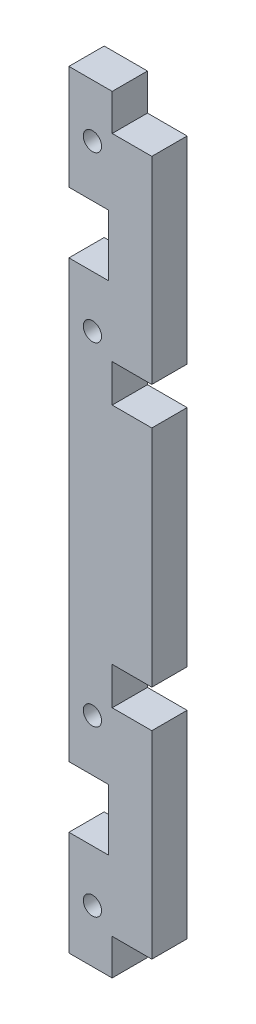
ISO-10303-21;
HEADER;
FILE_DESCRIPTION(('STEP AP214'),'2;1');
FILE_NAME('part.step','',(''),(''),'','','');
FILE_SCHEMA(('AUTOMOTIVE_DESIGN { 1 0 10303 214 1 1 1 1 }'));
ENDSEC;
DATA;
#1=APPLICATION_CONTEXT('core data for automotive mechanical design processes');
#2=APPLICATION_PROTOCOL_DEFINITION('international standard','automotive_design',2000,#1);
#3=PRODUCT_CONTEXT('',#1,'mechanical');
#4=PRODUCT('Part','Part','',(#3));
#5=PRODUCT_RELATED_PRODUCT_CATEGORY('part','',(#4));
#6=PRODUCT_DEFINITION_FORMATION('','',#4);
#7=PRODUCT_DEFINITION_CONTEXT('part definition',#1,'design');
#8=PRODUCT_DEFINITION('design','',#6,#7);
#9=PRODUCT_DEFINITION_SHAPE('','',#8);
#10=(LENGTH_UNIT() NAMED_UNIT(*) SI_UNIT(.MILLI.,.METRE.));
#11=(NAMED_UNIT(*) PLANE_ANGLE_UNIT() SI_UNIT($,.RADIAN.));
#12=(NAMED_UNIT(*) SI_UNIT($,.STERADIAN.) SOLID_ANGLE_UNIT());
#13=UNCERTAINTY_MEASURE_WITH_UNIT(LENGTH_MEASURE(1.E-05),#10,'distance_accuracy_value','');
#14=(GEOMETRIC_REPRESENTATION_CONTEXT(3) GLOBAL_UNCERTAINTY_ASSIGNED_CONTEXT((#13)) GLOBAL_UNIT_ASSIGNED_CONTEXT((#10,
#11,#12)) REPRESENTATION_CONTEXT('',''));
#15=CARTESIAN_POINT('',(0.,0.,0.));
#16=DIRECTION('',(0.,0.,1.));
#17=DIRECTION('',(1.,0.,0.));
#18=AXIS2_PLACEMENT_3D('',#15,#16,#17);
#19=CARTESIAN_POINT('',(-79.4504501830032,-66.5799999991971,-6.));
#20=DIRECTION('',(-1.,0.,0.));
#21=DIRECTION('',(0.,0.,1.));
#22=AXIS2_PLACEMENT_3D('',#19,#20,#21);
#23=PLANE('',#22);
#24=DIRECTION('',(0.,0.,1.));
#25=VECTOR('',#24,1.);
#26=CARTESIAN_POINT('',(-79.4504501830032,41.8000000008583,-6.));
#27=LINE('',#26,#25);
#28=CARTESIAN_POINT('',(-79.4504501830032,41.8000000008583,-6.));
#29=VERTEX_POINT('',#28);
#30=CARTESIAN_POINT('',(-79.4504501830032,41.8000000008583,0.));
#31=VERTEX_POINT('',#30);
#32=EDGE_CURVE('E227',#29,#31,#27,.T.);
#33=ORIENTED_EDGE('',*,*,#32,.F.);
#34=DIRECTION('',(0.,-1.,0.));
#35=VECTOR('',#34,1.);
#36=CARTESIAN_POINT('',(-79.4504501830032,-66.5799999991971,-6.));
#37=LINE('',#36,#35);
#38=CARTESIAN_POINT('',(-79.4504501829166,-32.3903116992488,-6.));
#39=VERTEX_POINT('',#38);
#40=EDGE_CURVE('E214',#29,#39,#37,.T.);
#41=ORIENTED_EDGE('',*,*,#40,.T.);
#42=DIRECTION('',(0.,0.,1.));
#43=VECTOR('',#42,1.);
#44=CARTESIAN_POINT('',(-79.4504501829166,-32.3903116992488,-6.));
#45=LINE('',#44,#43);
#46=CARTESIAN_POINT('',(-79.4504501829166,-32.3903116992488,0.));
#47=VERTEX_POINT('',#46);
#48=EDGE_CURVE('E332',#39,#47,#45,.T.);
#49=ORIENTED_EDGE('',*,*,#48,.T.);
#50=DIRECTION('',(0.,-1.,0.));
#51=VECTOR('',#50,1.);
#52=CARTESIAN_POINT('',(-79.4504501830032,-66.5799999991971,0.));
#53=LINE('',#52,#51);
#54=EDGE_CURVE('E363',#31,#47,#53,.T.);
#55=ORIENTED_EDGE('',*,*,#54,.F.);
#56=EDGE_LOOP('',(#33,#41,#49,#55));
#57=FACE_BOUND('',#56,.T.);
#58=ADVANCED_FACE('F35',(#57),#23,.T.);
#59=CARTESIAN_POINT('',(-65.3504501830032,-66.5799999991971,-6.));
#60=DIRECTION('',(1.,0.,0.));
#61=DIRECTION('',(0.,0.,-1.));
#62=AXIS2_PLACEMENT_3D('',#59,#60,#61);
#63=PLANE('',#62);
#64=DIRECTION('',(0.,0.,1.));
#65=VECTOR('',#64,1.);
#66=CARTESIAN_POINT('',(-65.3504501830032,-54.4370571475993,-6.));
#67=LINE('',#66,#65);
#68=CARTESIAN_POINT('',(-65.3504501830032,-54.4370571475993,-6.));
#69=VERTEX_POINT('',#68);
#70=CARTESIAN_POINT('',(-65.3504501830032,-54.4370571475993,0.));
#71=VERTEX_POINT('',#70);
#72=EDGE_CURVE('E57',#69,#71,#67,.T.);
#73=ORIENTED_EDGE('',*,*,#72,.F.);
#74=DIRECTION('',(0.,1.,0.));
#75=VECTOR('',#74,1.);
#76=CARTESIAN_POINT('',(-65.3504501830032,-66.5799999991971,-6.));
#77=LINE('',#76,#75);
#78=CARTESIAN_POINT('',(-65.3504501830032,-20.7799999992162,-6.));
#79=VERTEX_POINT('',#78);
#80=EDGE_CURVE('E341',#69,#79,#77,.T.);
#81=ORIENTED_EDGE('',*,*,#80,.T.);
#82=DIRECTION('',(0.,0.,-1.));
#83=VECTOR('',#82,1.);
#84=CARTESIAN_POINT('',(-65.3504501830032,-20.7799999992162,-6.));
#85=LINE('',#84,#83);
#86=CARTESIAN_POINT('',(-65.3504501830032,-20.7799999992162,0.));
#87=VERTEX_POINT('',#86);
#88=EDGE_CURVE('E269',#87,#79,#85,.T.);
#89=ORIENTED_EDGE('',*,*,#88,.F.);
#90=DIRECTION('',(0.,1.,0.));
#91=VECTOR('',#90,1.);
#92=CARTESIAN_POINT('',(-65.3504501830032,-66.5799999991971,0.));
#93=LINE('',#92,#91);
#94=EDGE_CURVE('E352',#71,#87,#93,.T.);
#95=ORIENTED_EDGE('',*,*,#94,.F.);
#96=EDGE_LOOP('',(#73,#81,#89,#95));
#97=FACE_BOUND('',#96,.T.);
#98=ADVANCED_FACE('F394',(#97),#63,.T.);
#99=DIRECTION('',(0.,0.,1.));
#100=VECTOR('',#99,1.);
#101=CARTESIAN_POINT('',(-65.3504501830032,-14.3799999992162,-6.));
#102=LINE('',#101,#100);
#103=CARTESIAN_POINT('',(-65.3504501830032,-14.3799999992162,-6.));
#104=VERTEX_POINT('',#103);
#105=CARTESIAN_POINT('',(-65.3504501830032,-14.3799999992162,0.));
#106=VERTEX_POINT('',#105);
#107=EDGE_CURVE('E265',#104,#106,#102,.T.);
#108=ORIENTED_EDGE('',*,*,#107,.F.);
#109=CARTESIAN_POINT('',(-65.3504501830032,23.8000000008046,-6.));
#110=VERTEX_POINT('',#109);
#111=EDGE_CURVE('E344',#104,#110,#77,.T.);
#112=ORIENTED_EDGE('',*,*,#111,.T.);
#113=DIRECTION('',(0.,0.,-1.));
#114=VECTOR('',#113,1.);
#115=CARTESIAN_POINT('',(-65.3504501830032,23.8000000008046,-6.));
#116=LINE('',#115,#114);
#117=CARTESIAN_POINT('',(-65.3504501830032,23.8000000008046,0.));
#118=VERTEX_POINT('',#117);
#119=EDGE_CURVE('E294',#118,#110,#116,.T.);
#120=ORIENTED_EDGE('',*,*,#119,.F.);
#121=EDGE_CURVE('E355',#106,#118,#93,.T.);
#122=ORIENTED_EDGE('',*,*,#121,.F.);
#123=EDGE_LOOP('',(#108,#112,#120,#122));
#124=FACE_BOUND('',#123,.T.);
#125=ADVANCED_FACE('F398',(#124),#63,.T.);
#126=DIRECTION('',(0.,0.,1.));
#127=VECTOR('',#126,1.);
#128=CARTESIAN_POINT('',(-79.4504501829166,52.2000000008047,-6.));
#129=LINE('',#128,#127);
#130=CARTESIAN_POINT('',(-79.4504501829166,52.2000000008047,-6.));
#131=VERTEX_POINT('',#130);
#132=CARTESIAN_POINT('',(-79.4504501829166,52.2000000008047,0.));
#133=VERTEX_POINT('',#132);
#134=EDGE_CURVE('E230',#131,#133,#129,.T.);
#135=ORIENTED_EDGE('',*,*,#134,.T.);
#136=CARTESIAN_POINT('',(-79.4504501830032,70.0000000008487,0.));
#137=VERTEX_POINT('',#136);
#138=EDGE_CURVE('E359',#137,#133,#53,.T.);
#139=ORIENTED_EDGE('',*,*,#138,.F.);
#140=DIRECTION('',(0.,0.,1.));
#141=VECTOR('',#140,1.);
#142=CARTESIAN_POINT('',(-79.4504501830032,70.0000000008487,-6.));
#143=LINE('',#142,#141);
#144=CARTESIAN_POINT('',(-79.4504501830032,70.0000000008487,-6.));
#145=VERTEX_POINT('',#144);
#146=EDGE_CURVE('E351',#145,#137,#143,.T.);
#147=ORIENTED_EDGE('',*,*,#146,.F.);
#148=EDGE_CURVE('E348',#145,#131,#37,.T.);
#149=ORIENTED_EDGE('',*,*,#148,.T.);
#150=EDGE_LOOP('',(#135,#139,#147,#149));
#151=FACE_BOUND('',#150,.T.);
#152=ADVANCED_FACE('F426',(#151),#23,.T.);
#153=CARTESIAN_POINT('',(-79.4504501830032,-60.5799999991971,-6.));
#154=DIRECTION('',(0.,-1.,0.));
#155=DIRECTION('',(0.,0.,-1.));
#156=AXIS2_PLACEMENT_3D('',#153,#154,#155);
#157=PLANE('',#156);
#158=DIRECTION('',(0.,0.,-1.));
#159=VECTOR('',#158,1.);
#160=CARTESIAN_POINT('',(-72.1004501830032,-60.5799999991971,-6.));
#161=LINE('',#160,#159);
#162=CARTESIAN_POINT('',(-72.1004501830032,-60.5799999991971,0.));
#163=VERTEX_POINT('',#162);
#164=CARTESIAN_POINT('',(-72.1004501830032,-60.5799999991971,-6.));
#165=VERTEX_POINT('',#164);
#166=EDGE_CURVE('E245',#163,#165,#161,.T.);
#167=ORIENTED_EDGE('',*,*,#166,.F.);
#168=DIRECTION('',(1.,0.,0.));
#169=VECTOR('',#168,1.);
#170=CARTESIAN_POINT('',(0.,-60.5799999991971,0.));
#171=LINE('',#170,#169);
#172=CARTESIAN_POINT('',(-79.4504501830032,-60.5799999991971,0.));
#173=VERTEX_POINT('',#172);
#174=EDGE_CURVE('E335',#173,#163,#171,.T.);
#175=ORIENTED_EDGE('',*,*,#174,.F.);
#176=DIRECTION('',(0.,0.,1.));
#177=VECTOR('',#176,1.);
#178=CARTESIAN_POINT('',(-79.4504501830032,-60.5799999991971,-6.));
#179=LINE('',#178,#177);
#180=CARTESIAN_POINT('',(-79.4504501830032,-60.5799999991971,-6.));
#181=VERTEX_POINT('',#180);
#182=EDGE_CURVE('E366',#181,#173,#179,.T.);
#183=ORIENTED_EDGE('',*,*,#182,.F.);
#184=DIRECTION('',(1.,0.,0.));
#185=VECTOR('',#184,1.);
#186=CARTESIAN_POINT('',(0.,-60.5799999991971,-6.));
#187=LINE('',#186,#185);
#188=EDGE_CURVE('E362',#181,#165,#187,.T.);
#189=ORIENTED_EDGE('',*,*,#188,.T.);
#190=EDGE_LOOP('',(#167,#175,#183,#189));
#191=FACE_BOUND('',#190,.T.);
#192=ADVANCED_FACE('F37',(#191),#157,.T.);
#193=DIRECTION('',(0.,0.,1.));
#194=VECTOR('',#193,1.);
#195=CARTESIAN_POINT('',(-79.4504501829166,-42.7903116991952,-6.));
#196=LINE('',#195,#194);
#197=CARTESIAN_POINT('',(-79.4504501829166,-42.7903116991952,-6.));
#198=VERTEX_POINT('',#197);
#199=CARTESIAN_POINT('',(-79.4504501830032,-42.7903116991952,0.));
#200=VERTEX_POINT('',#199);
#201=EDGE_CURVE('E324',#198,#200,#196,.T.);
#202=ORIENTED_EDGE('',*,*,#201,.F.);
#203=EDGE_CURVE('E347',#198,#181,#37,.T.);
#204=ORIENTED_EDGE('',*,*,#203,.T.);
#205=ORIENTED_EDGE('',*,*,#182,.T.);
#206=EDGE_CURVE('E358',#200,#173,#53,.T.);
#207=ORIENTED_EDGE('',*,*,#206,.F.);
#208=EDGE_LOOP('',(#202,#204,#205,#207));
#209=FACE_BOUND('',#208,.T.);
#210=ADVANCED_FACE('F441',(#209),#23,.T.);
#211=CARTESIAN_POINT('',(-79.4504501830032,70.0000000008487,-6.));
#212=DIRECTION('',(0.,1.,0.));
#213=DIRECTION('',(0.,0.,1.));
#214=AXIS2_PLACEMENT_3D('',#211,#212,#213);
#215=PLANE('',#214);
#216=DIRECTION('',(0.,0.,1.));
#217=VECTOR('',#216,1.);
#218=CARTESIAN_POINT('',(-72.088894602048,70.0000000008487,-6.));
#219=LINE('',#218,#217);
#220=CARTESIAN_POINT('',(-72.088894602048,70.0000000008487,-6.));
#221=VERTEX_POINT('',#220);
#222=CARTESIAN_POINT('',(-72.088894602048,70.0000000008487,0.));
#223=VERTEX_POINT('',#222);
#224=EDGE_CURVE('E309',#221,#223,#219,.T.);
#225=ORIENTED_EDGE('',*,*,#224,.F.);
#226=DIRECTION('',(-1.,0.,0.));
#227=VECTOR('',#226,1.);
#228=CARTESIAN_POINT('',(-79.4504501830032,70.0000000008487,-6.));
#229=LINE('',#228,#227);
#230=EDGE_CURVE('E343',#221,#145,#229,.T.);
#231=ORIENTED_EDGE('',*,*,#230,.T.);
#232=ORIENTED_EDGE('',*,*,#146,.T.);
#233=DIRECTION('',(-1.,0.,0.));
#234=VECTOR('',#233,1.);
#235=CARTESIAN_POINT('',(-79.4504501830032,70.0000000008487,0.));
#236=LINE('',#235,#234);
#237=EDGE_CURVE('E354',#223,#137,#236,.T.);
#238=ORIENTED_EDGE('',*,*,#237,.F.);
#239=EDGE_LOOP('',(#225,#231,#232,#238));
#240=FACE_BOUND('',#239,.T.);
#241=ADVANCED_FACE('F421',(#240),#215,.T.);
#242=DIRECTION('',(0.,0.,1.));
#243=VECTOR('',#242,1.);
#244=CARTESIAN_POINT('',(-65.3504501830032,30.2000000008046,-6.));
#245=LINE('',#244,#243);
#246=CARTESIAN_POINT('',(-65.3504501830032,30.2000000008046,-6.));
#247=VERTEX_POINT('',#246);
#248=CARTESIAN_POINT('',(-65.3504501830032,30.2000000008046,0.));
#249=VERTEX_POINT('',#248);
#250=EDGE_CURVE('E290',#247,#249,#245,.T.);
#251=ORIENTED_EDGE('',*,*,#250,.F.);
#252=CARTESIAN_POINT('',(-65.3504501830032,63.8000000008487,-6.));
#253=VERTEX_POINT('',#252);
#254=EDGE_CURVE('E345',#247,#253,#77,.T.);
#255=ORIENTED_EDGE('',*,*,#254,.T.);
#256=DIRECTION('',(0.,0.,-1.));
#257=VECTOR('',#256,1.);
#258=CARTESIAN_POINT('',(-65.3504501830032,63.8000000008487,-6.));
#259=LINE('',#258,#257);
#260=CARTESIAN_POINT('',(-65.3504501830032,63.8000000008487,0.));
#261=VERTEX_POINT('',#260);
#262=EDGE_CURVE('E311',#261,#253,#259,.T.);
#263=ORIENTED_EDGE('',*,*,#262,.F.);
#264=EDGE_CURVE('E356',#249,#261,#93,.T.);
#265=ORIENTED_EDGE('',*,*,#264,.F.);
#266=EDGE_LOOP('',(#251,#255,#263,#265));
#267=FACE_BOUND('',#266,.T.);
#268=ADVANCED_FACE('F412',(#267),#63,.T.);
#269=CARTESIAN_POINT('',(0.,0.,-6.));
#270=DIRECTION('',(0.,0.,1.));
#271=DIRECTION('',(1.,0.,0.));
#272=AXIS2_PLACEMENT_3D('',#269,#270,#271);
#273=PLANE('',#272);
#274=CARTESIAN_POINT('',(-75.4504501830032,-23.5799999991971,-6.));
#275=DIRECTION('',(0.,0.,1.));
#276=DIRECTION('',(1.,0.,0.));
#277=AXIS2_PLACEMENT_3D('',#274,#275,#276);
#278=CIRCLE('',#277,1.54999999999999);
#279=CARTESIAN_POINT('',(-73.9004501830032,-23.5799999991971,-6.));
#280=VERTEX_POINT('',#279);
#281=EDGE_CURVE('E673',#280,#280,#278,.T.);
#282=ORIENTED_EDGE('',*,*,#281,.T.);
#283=EDGE_LOOP('',(#282));
#284=FACE_BOUND('',#283,.T.);
#285=CARTESIAN_POINT('',(-75.4504501830032,33.0000000008487,-6.));
#286=DIRECTION('',(0.,0.,1.));
#287=DIRECTION('',(1.,0.,0.));
#288=AXIS2_PLACEMENT_3D('',#285,#286,#287);
#289=CIRCLE('',#288,1.54999999998711);
#290=CARTESIAN_POINT('',(-73.9004501830161,33.0000000008487,-6.));
#291=VERTEX_POINT('',#290);
#292=EDGE_CURVE('E682',#291,#291,#289,.T.);
#293=ORIENTED_EDGE('',*,*,#292,.T.);
#294=EDGE_LOOP('',(#293));
#295=FACE_BOUND('',#294,.T.);
#296=CARTESIAN_POINT('',(-75.4504501830032,-51.5799999991971,-6.));
#297=DIRECTION('',(0.,0.,1.));
#298=DIRECTION('',(1.,0.,0.));
#299=AXIS2_PLACEMENT_3D('',#296,#297,#298);
#300=CIRCLE('',#299,1.54999999999999);
#301=CARTESIAN_POINT('',(-73.9004501830032,-51.5799999991971,-6.));
#302=VERTEX_POINT('',#301);
#303=EDGE_CURVE('E688',#302,#302,#300,.T.);
#304=ORIENTED_EDGE('',*,*,#303,.T.);
#305=EDGE_LOOP('',(#304));
#306=FACE_BOUND('',#305,.T.);
#307=CARTESIAN_POINT('',(-75.4504501830032,61.0000000008487,-6.));
#308=DIRECTION('',(0.,0.,1.));
#309=DIRECTION('',(1.,0.,0.));
#310=AXIS2_PLACEMENT_3D('',#307,#308,#309);
#311=CIRCLE('',#310,1.54999999998711);
#312=CARTESIAN_POINT('',(-73.9004501830161,61.0000000008487,-6.));
#313=VERTEX_POINT('',#312);
#314=EDGE_CURVE('E225',#313,#313,#311,.T.);
#315=ORIENTED_EDGE('',*,*,#314,.T.);
#316=EDGE_LOOP('',(#315));
#317=FACE_BOUND('',#316,.T.);
#318=ORIENTED_EDGE('',*,*,#40,.F.);
#319=DIRECTION('',(1.,0.,0.));
#320=VECTOR('',#319,1.);
#321=CARTESIAN_POINT('',(-72.7004501830032,41.8000000008583,-6.));
#322=LINE('',#321,#320);
#323=CARTESIAN_POINT('',(-72.7004501830032,41.8000000008583,-6.));
#324=VERTEX_POINT('',#323);
#325=EDGE_CURVE('E196',#29,#324,#322,.T.);
#326=ORIENTED_EDGE('',*,*,#325,.T.);
#327=DIRECTION('',(0.,1.,0.));
#328=VECTOR('',#327,1.);
#329=CARTESIAN_POINT('',(-72.7004501830032,52.2000000008047,-6.));
#330=LINE('',#329,#328);
#331=CARTESIAN_POINT('',(-72.7004501830032,52.2000000008047,-6.));
#332=VERTEX_POINT('',#331);
#333=EDGE_CURVE('E205',#324,#332,#330,.T.);
#334=ORIENTED_EDGE('',*,*,#333,.T.);
#335=DIRECTION('',(-1.,0.,0.));
#336=VECTOR('',#335,1.);
#337=CARTESIAN_POINT('',(-79.4504501829166,52.2000000008047,-6.));
#338=LINE('',#337,#336);
#339=EDGE_CURVE('E202',#332,#131,#338,.T.);
#340=ORIENTED_EDGE('',*,*,#339,.T.);
#341=ORIENTED_EDGE('',*,*,#148,.F.);
#342=ORIENTED_EDGE('',*,*,#230,.F.);
#343=DIRECTION('',(0.,-1.,0.));
#344=VECTOR('',#343,1.);
#345=CARTESIAN_POINT('',(-72.088894602048,70.2000000008487,-6.));
#346=LINE('',#345,#344);
#347=CARTESIAN_POINT('',(-72.088894602048,63.8000000008487,-6.));
#348=VERTEX_POINT('',#347);
#349=EDGE_CURVE('E298',#221,#348,#346,.T.);
#350=ORIENTED_EDGE('',*,*,#349,.T.);
#351=DIRECTION('',(1.,0.,0.));
#352=VECTOR('',#351,1.);
#353=CARTESIAN_POINT('',(-72.088894602048,63.8000000008487,-6.));
#354=LINE('',#353,#352);
#355=EDGE_CURVE('E301',#348,#253,#354,.T.);
#356=ORIENTED_EDGE('',*,*,#355,.T.);
#357=ORIENTED_EDGE('',*,*,#254,.F.);
#358=DIRECTION('',(-1.,0.,0.));
#359=VECTOR('',#358,1.);
#360=CARTESIAN_POINT('',(-65.138894602048,30.2000000008046,-6.));
#361=LINE('',#360,#359);
#362=CARTESIAN_POINT('',(-72.0888946021054,30.2000000008046,-6.));
#363=VERTEX_POINT('',#362);
#364=EDGE_CURVE('E273',#247,#363,#361,.T.);
#365=ORIENTED_EDGE('',*,*,#364,.T.);
#366=DIRECTION('',(0.,-1.,0.));
#367=VECTOR('',#366,1.);
#368=CARTESIAN_POINT('',(-72.0888946021054,30.2000000008046,-6.));
#369=LINE('',#368,#367);
#370=CARTESIAN_POINT('',(-72.0888946021054,23.8000000008046,-6.));
#371=VERTEX_POINT('',#370);
#372=EDGE_CURVE('E276',#363,#371,#369,.T.);
#373=ORIENTED_EDGE('',*,*,#372,.T.);
#374=DIRECTION('',(1.,0.,0.));
#375=VECTOR('',#374,1.);
#376=CARTESIAN_POINT('',(-72.0888946021054,23.8000000008046,-6.));
#377=LINE('',#376,#375);
#378=EDGE_CURVE('E280',#371,#110,#377,.T.);
#379=ORIENTED_EDGE('',*,*,#378,.T.);
#380=ORIENTED_EDGE('',*,*,#111,.F.);
#381=DIRECTION('',(-1.,0.,0.));
#382=VECTOR('',#381,1.);
#383=CARTESIAN_POINT('',(-65.138894602048,-14.3799999992162,-6.));
#384=LINE('',#383,#382);
#385=CARTESIAN_POINT('',(-72.0888946021054,-14.3799999992162,-6.));
#386=VERTEX_POINT('',#385);
#387=EDGE_CURVE('E248',#104,#386,#384,.T.);
#388=ORIENTED_EDGE('',*,*,#387,.T.);
#389=DIRECTION('',(0.,-1.,0.));
#390=VECTOR('',#389,1.);
#391=CARTESIAN_POINT('',(-72.0888946021054,-14.3799999992162,-6.));
#392=LINE('',#391,#390);
#393=CARTESIAN_POINT('',(-72.0888946021054,-20.7799999992162,-6.));
#394=VERTEX_POINT('',#393);
#395=EDGE_CURVE('E251',#386,#394,#392,.T.);
#396=ORIENTED_EDGE('',*,*,#395,.T.);
#397=DIRECTION('',(1.,0.,0.));
#398=VECTOR('',#397,1.);
#399=CARTESIAN_POINT('',(-72.0888946021054,-20.7799999992162,-6.));
#400=LINE('',#399,#398);
#401=EDGE_CURVE('E255',#394,#79,#400,.T.);
#402=ORIENTED_EDGE('',*,*,#401,.T.);
#403=ORIENTED_EDGE('',*,*,#80,.F.);
#404=DIRECTION('',(-1.,0.,0.));
#405=VECTOR('',#404,1.);
#406=CARTESIAN_POINT('',(-72.1004501830032,-54.4370571475993,-6.));
#407=LINE('',#406,#405);
#408=CARTESIAN_POINT('',(-72.1004501830032,-54.4370571475993,-6.));
#409=VERTEX_POINT('',#408);
#410=EDGE_CURVE('E234',#69,#409,#407,.T.);
#411=ORIENTED_EDGE('',*,*,#410,.T.);
#412=DIRECTION('',(0.,-1.,0.));
#413=VECTOR('',#412,1.);
#414=CARTESIAN_POINT('',(-72.1004501830032,-60.7799999991971,-6.));
#415=LINE('',#414,#413);
#416=EDGE_CURVE('E237',#409,#165,#415,.T.);
#417=ORIENTED_EDGE('',*,*,#416,.T.);
#418=ORIENTED_EDGE('',*,*,#188,.F.);
#419=ORIENTED_EDGE('',*,*,#203,.F.);
#420=DIRECTION('',(1.,0.,0.));
#421=VECTOR('',#420,1.);
#422=CARTESIAN_POINT('',(-72.7004501830032,-42.7903116991952,-6.));
#423=LINE('',#422,#421);
#424=CARTESIAN_POINT('',(-72.7004501830032,-42.7903116991952,-6.));
#425=VERTEX_POINT('',#424);
#426=EDGE_CURVE('E315',#198,#425,#423,.T.);
#427=ORIENTED_EDGE('',*,*,#426,.T.);
#428=DIRECTION('',(0.,1.,0.));
#429=VECTOR('',#428,1.);
#430=CARTESIAN_POINT('',(-72.7004501830032,-32.3903116992488,-6.));
#431=LINE('',#430,#429);
#432=CARTESIAN_POINT('',(-72.7004501830032,-32.3903116992488,-6.));
#433=VERTEX_POINT('',#432);
#434=EDGE_CURVE('E318',#425,#433,#431,.T.);
#435=ORIENTED_EDGE('',*,*,#434,.T.);
#436=DIRECTION('',(-1.,0.,0.));
#437=VECTOR('',#436,1.);
#438=CARTESIAN_POINT('',(-79.4504501829166,-32.3903116992488,-6.));
#439=LINE('',#438,#437);
#440=EDGE_CURVE('E322',#433,#39,#439,.T.);
#441=ORIENTED_EDGE('',*,*,#440,.T.);
#442=EDGE_LOOP('',(#318,#326,#334,#340,#341,#342,#350,#356,#357,#365,#373,#379,#380,#388,#396,
#402,#403,#411,#417,#418,#419,#427,#435,#441));
#443=FACE_BOUND('',#442,.T.);
#444=ADVANCED_FACE('F212',(#284,#295,#306,#317,#443),#273,.F.);
#445=CARTESIAN_POINT('',(0.,0.,0.));
#446=DIRECTION('',(0.,0.,1.));
#447=DIRECTION('',(1.,0.,0.));
#448=AXIS2_PLACEMENT_3D('',#445,#446,#447);
#449=PLANE('',#448);
#450=CARTESIAN_POINT('',(-75.4504501830032,-23.5799999991971,0.));
#451=DIRECTION('',(0.,0.,1.));
#452=DIRECTION('',(1.,0.,0.));
#453=AXIS2_PLACEMENT_3D('',#450,#451,#452);
#454=CIRCLE('',#453,1.54999999999999);
#455=CARTESIAN_POINT('',(-73.9004501830032,-23.5799999991971,0.));
#456=VERTEX_POINT('',#455);
#457=EDGE_CURVE('E676',#456,#456,#454,.T.);
#458=ORIENTED_EDGE('',*,*,#457,.F.);
#459=EDGE_LOOP('',(#458));
#460=FACE_BOUND('',#459,.T.);
#461=CARTESIAN_POINT('',(-75.4504501830032,33.0000000008487,0.));
#462=DIRECTION('',(0.,0.,1.));
#463=DIRECTION('',(1.,0.,0.));
#464=AXIS2_PLACEMENT_3D('',#461,#462,#463);
#465=CIRCLE('',#464,1.54999999998711);
#466=CARTESIAN_POINT('',(-73.9004501830161,33.0000000008487,0.));
#467=VERTEX_POINT('',#466);
#468=EDGE_CURVE('E679',#467,#467,#465,.T.);
#469=ORIENTED_EDGE('',*,*,#468,.F.);
#470=EDGE_LOOP('',(#469));
#471=FACE_BOUND('',#470,.T.);
#472=CARTESIAN_POINT('',(-75.4504501830032,-51.5799999991971,0.));
#473=DIRECTION('',(0.,0.,1.));
#474=DIRECTION('',(1.,0.,0.));
#475=AXIS2_PLACEMENT_3D('',#472,#473,#474);
#476=CIRCLE('',#475,1.54999999999999);
#477=CARTESIAN_POINT('',(-73.9004501830032,-51.5799999991971,0.));
#478=VERTEX_POINT('',#477);
#479=EDGE_CURVE('E685',#478,#478,#476,.T.);
#480=ORIENTED_EDGE('',*,*,#479,.F.);
#481=EDGE_LOOP('',(#480));
#482=FACE_BOUND('',#481,.T.);
#483=CARTESIAN_POINT('',(-75.4504501830032,61.0000000008487,0.));
#484=DIRECTION('',(0.,0.,1.));
#485=DIRECTION('',(1.,0.,0.));
#486=AXIS2_PLACEMENT_3D('',#483,#484,#485);
#487=CIRCLE('',#486,1.54999999998711);
#488=CARTESIAN_POINT('',(-73.9004501830161,61.0000000008487,0.));
#489=VERTEX_POINT('',#488);
#490=EDGE_CURVE('E220',#489,#489,#487,.T.);
#491=ORIENTED_EDGE('',*,*,#490,.F.);
#492=EDGE_LOOP('',(#491));
#493=FACE_BOUND('',#492,.T.);
#494=DIRECTION('',(1.,0.,0.));
#495=VECTOR('',#494,1.);
#496=CARTESIAN_POINT('',(-72.7004501830032,41.8000000008583,0.));
#497=LINE('',#496,#495);
#498=CARTESIAN_POINT('',(-72.7004501830032,41.8000000008583,0.));
#499=VERTEX_POINT('',#498);
#500=EDGE_CURVE('E50',#31,#499,#497,.T.);
#501=ORIENTED_EDGE('',*,*,#500,.F.);
#502=ORIENTED_EDGE('',*,*,#54,.T.);
#503=DIRECTION('',(-1.,0.,0.));
#504=VECTOR('',#503,1.);
#505=CARTESIAN_POINT('',(-79.4504501829166,-32.3903116992488,0.));
#506=LINE('',#505,#504);
#507=CARTESIAN_POINT('',(-72.7004501830032,-32.3903116992488,0.));
#508=VERTEX_POINT('',#507);
#509=EDGE_CURVE('E319',#508,#47,#506,.T.);
#510=ORIENTED_EDGE('',*,*,#509,.F.);
#511=DIRECTION('',(0.,1.,0.));
#512=VECTOR('',#511,1.);
#513=CARTESIAN_POINT('',(-72.7004501830032,-32.3903116992488,0.));
#514=LINE('',#513,#512);
#515=CARTESIAN_POINT('',(-72.7004501830032,-42.7903116991952,0.));
#516=VERTEX_POINT('',#515);
#517=EDGE_CURVE('E327',#516,#508,#514,.T.);
#518=ORIENTED_EDGE('',*,*,#517,.F.);
#519=DIRECTION('',(1.,0.,0.));
#520=VECTOR('',#519,1.);
#521=CARTESIAN_POINT('',(-72.7004501830032,-42.7903116991952,0.));
#522=LINE('',#521,#520);
#523=EDGE_CURVE('E314',#200,#516,#522,.T.);
#524=ORIENTED_EDGE('',*,*,#523,.F.);
#525=ORIENTED_EDGE('',*,*,#206,.T.);
#526=ORIENTED_EDGE('',*,*,#174,.T.);
#527=DIRECTION('',(0.,-1.,0.));
#528=VECTOR('',#527,1.);
#529=CARTESIAN_POINT('',(-72.1004501830032,-60.7799999991971,0.));
#530=LINE('',#529,#528);
#531=CARTESIAN_POINT('',(-72.1004501830032,-54.4370571475993,0.));
#532=VERTEX_POINT('',#531);
#533=EDGE_CURVE('E229',#532,#163,#530,.T.);
#534=ORIENTED_EDGE('',*,*,#533,.F.);
#535=DIRECTION('',(-1.,0.,0.));
#536=VECTOR('',#535,1.);
#537=CARTESIAN_POINT('',(0.,-54.4370571475993,0.));
#538=LINE('',#537,#536);
#539=EDGE_CURVE('E12',#71,#532,#538,.T.);
#540=ORIENTED_EDGE('',*,*,#539,.F.);
#541=ORIENTED_EDGE('',*,*,#94,.T.);
#542=DIRECTION('',(1.,0.,0.));
#543=VECTOR('',#542,1.);
#544=CARTESIAN_POINT('',(-72.0888946021054,-20.7799999992162,0.));
#545=LINE('',#544,#543);
#546=CARTESIAN_POINT('',(-72.0888946021054,-20.7799999992162,0.));
#547=VERTEX_POINT('',#546);
#548=EDGE_CURVE('E252',#547,#87,#545,.T.);
#549=ORIENTED_EDGE('',*,*,#548,.F.);
#550=DIRECTION('',(0.,-1.,0.));
#551=VECTOR('',#550,1.);
#552=CARTESIAN_POINT('',(-72.0888946021054,-14.3799999992162,0.));
#553=LINE('',#552,#551);
#554=CARTESIAN_POINT('',(-72.0888946021054,-14.3799999992162,0.));
#555=VERTEX_POINT('',#554);
#556=EDGE_CURVE('E247',#555,#547,#553,.T.);
#557=ORIENTED_EDGE('',*,*,#556,.F.);
#558=DIRECTION('',(-1.,0.,0.));
#559=VECTOR('',#558,1.);
#560=CARTESIAN_POINT('',(0.,-14.3799999992162,0.));
#561=LINE('',#560,#559);
#562=EDGE_CURVE('E43',#106,#555,#561,.T.);
#563=ORIENTED_EDGE('',*,*,#562,.F.);
#564=ORIENTED_EDGE('',*,*,#121,.T.);
#565=DIRECTION('',(1.,0.,0.));
#566=VECTOR('',#565,1.);
#567=CARTESIAN_POINT('',(-72.0888946021054,23.8000000008046,0.));
#568=LINE('',#567,#566);
#569=CARTESIAN_POINT('',(-72.0888946021054,23.8000000008046,0.));
#570=VERTEX_POINT('',#569);
#571=EDGE_CURVE('E277',#570,#118,#568,.T.);
#572=ORIENTED_EDGE('',*,*,#571,.F.);
#573=DIRECTION('',(0.,-1.,0.));
#574=VECTOR('',#573,1.);
#575=CARTESIAN_POINT('',(-72.0888946021054,30.2000000008046,0.));
#576=LINE('',#575,#574);
#577=CARTESIAN_POINT('',(-72.0888946021054,30.2000000008046,0.));
#578=VERTEX_POINT('',#577);
#579=EDGE_CURVE('E272',#578,#570,#576,.T.);
#580=ORIENTED_EDGE('',*,*,#579,.F.);
#581=DIRECTION('',(-1.,0.,0.));
#582=VECTOR('',#581,1.);
#583=CARTESIAN_POINT('',(0.,30.2000000008046,0.));
#584=LINE('',#583,#582);
#585=EDGE_CURVE('E375',#249,#578,#584,.T.);
#586=ORIENTED_EDGE('',*,*,#585,.F.);
#587=ORIENTED_EDGE('',*,*,#264,.T.);
#588=DIRECTION('',(1.,0.,0.));
#589=VECTOR('',#588,1.);
#590=CARTESIAN_POINT('',(-72.088894602048,63.8000000008487,0.));
#591=LINE('',#590,#589);
#592=CARTESIAN_POINT('',(-72.088894602048,63.8000000008487,0.));
#593=VERTEX_POINT('',#592);
#594=EDGE_CURVE('E297',#593,#261,#591,.T.);
#595=ORIENTED_EDGE('',*,*,#594,.F.);
#596=DIRECTION('',(0.,-1.,0.));
#597=VECTOR('',#596,1.);
#598=CARTESIAN_POINT('',(-72.088894602048,0.,0.));
#599=LINE('',#598,#597);
#600=EDGE_CURVE('E373',#223,#593,#599,.T.);
#601=ORIENTED_EDGE('',*,*,#600,.F.);
#602=ORIENTED_EDGE('',*,*,#237,.T.);
#603=ORIENTED_EDGE('',*,*,#138,.T.);
#604=DIRECTION('',(-1.,0.,0.));
#605=VECTOR('',#604,1.);
#606=CARTESIAN_POINT('',(-79.4504501829166,52.2000000008047,0.));
#607=LINE('',#606,#605);
#608=CARTESIAN_POINT('',(-72.7004501830032,52.2000000008047,0.));
#609=VERTEX_POINT('',#608);
#610=EDGE_CURVE('E215',#609,#133,#607,.T.);
#611=ORIENTED_EDGE('',*,*,#610,.F.);
#612=DIRECTION('',(0.,1.,0.));
#613=VECTOR('',#612,1.);
#614=CARTESIAN_POINT('',(-72.7004501830032,52.2000000008047,0.));
#615=LINE('',#614,#613);
#616=EDGE_CURVE('E217',#499,#609,#615,.T.);
#617=ORIENTED_EDGE('',*,*,#616,.F.);
#618=EDGE_LOOP('',(#501,#502,#510,#518,#524,#525,#526,#534,#540,#541,#549,#557,#563,#564,#572,
#580,#586,#587,#595,#601,#602,#603,#611,#617));
#619=FACE_BOUND('',#618,.T.);
#620=ADVANCED_FACE('F387',(#460,#471,#482,#493,#619),#449,.T.);
#621=CARTESIAN_POINT('',(-79.4504501829166,-32.3903116992488,-6.));
#622=DIRECTION('',(0.,1.,0.));
#623=DIRECTION('',(0.,0.,1.));
#624=AXIS2_PLACEMENT_3D('',#621,#622,#623);
#625=PLANE('',#624);
#626=ORIENTED_EDGE('',*,*,#509,.T.);
#627=ORIENTED_EDGE('',*,*,#48,.F.);
#628=ORIENTED_EDGE('',*,*,#440,.F.);
#629=DIRECTION('',(0.,0.,1.));
#630=VECTOR('',#629,1.);
#631=CARTESIAN_POINT('',(-72.7004501830032,-32.3903116992488,-6.));
#632=LINE('',#631,#630);
#633=EDGE_CURVE('E336',#433,#508,#632,.T.);
#634=ORIENTED_EDGE('',*,*,#633,.T.);
#635=EDGE_LOOP('',(#626,#627,#628,#634));
#636=FACE_BOUND('',#635,.T.);
#637=ADVANCED_FACE('F451',(#636),#625,.F.);
#638=CARTESIAN_POINT('',(-72.7004501830032,-32.3903116992488,-6.));
#639=DIRECTION('',(1.,0.,0.));
#640=DIRECTION('',(0.,0.,-1.));
#641=AXIS2_PLACEMENT_3D('',#638,#639,#640);
#642=PLANE('',#641);
#643=ORIENTED_EDGE('',*,*,#517,.T.);
#644=ORIENTED_EDGE('',*,*,#633,.F.);
#645=ORIENTED_EDGE('',*,*,#434,.F.);
#646=DIRECTION('',(0.,0.,1.));
#647=VECTOR('',#646,1.);
#648=CARTESIAN_POINT('',(-72.7004501830032,-42.7903116991952,-6.));
#649=LINE('',#648,#647);
#650=EDGE_CURVE('E338',#425,#516,#649,.T.);
#651=ORIENTED_EDGE('',*,*,#650,.T.);
#652=EDGE_LOOP('',(#643,#644,#645,#651));
#653=FACE_BOUND('',#652,.T.);
#654=ADVANCED_FACE('F454',(#653),#642,.F.);
#655=CARTESIAN_POINT('',(-72.7004501830032,-42.7903116991952,-6.));
#656=DIRECTION('',(0.,-1.,0.));
#657=DIRECTION('',(0.,0.,-1.));
#658=AXIS2_PLACEMENT_3D('',#655,#656,#657);
#659=PLANE('',#658);
#660=ORIENTED_EDGE('',*,*,#523,.T.);
#661=ORIENTED_EDGE('',*,*,#650,.F.);
#662=ORIENTED_EDGE('',*,*,#426,.F.);
#663=ORIENTED_EDGE('',*,*,#201,.T.);
#664=EDGE_LOOP('',(#660,#661,#662,#663));
#665=FACE_BOUND('',#664,.T.);
#666=ADVANCED_FACE('F456',(#665),#659,.F.);
#667=CARTESIAN_POINT('',(-72.088894602048,63.8000000008487,-6.));
#668=DIRECTION('',(0.,-1.,0.));
#669=DIRECTION('',(0.,0.,-1.));
#670=AXIS2_PLACEMENT_3D('',#667,#668,#669);
#671=PLANE('',#670);
#672=ORIENTED_EDGE('',*,*,#262,.T.);
#673=ORIENTED_EDGE('',*,*,#355,.F.);
#674=DIRECTION('',(0.,0.,1.));
#675=VECTOR('',#674,1.);
#676=CARTESIAN_POINT('',(-72.088894602048,63.8000000008487,-6.));
#677=LINE('',#676,#675);
#678=EDGE_CURVE('E304',#348,#593,#677,.T.);
#679=ORIENTED_EDGE('',*,*,#678,.T.);
#680=ORIENTED_EDGE('',*,*,#594,.T.);
#681=EDGE_LOOP('',(#672,#673,#679,#680));
#682=FACE_BOUND('',#681,.T.);
#683=ADVANCED_FACE('F410',(#682),#671,.F.);
#684=CARTESIAN_POINT('',(-72.088894602048,70.2000000008487,-6.));
#685=DIRECTION('',(-1.,0.,0.));
#686=DIRECTION('',(0.,0.,1.));
#687=AXIS2_PLACEMENT_3D('',#684,#685,#686);
#688=PLANE('',#687);
#689=ORIENTED_EDGE('',*,*,#224,.T.);
#690=ORIENTED_EDGE('',*,*,#600,.T.);
#691=ORIENTED_EDGE('',*,*,#678,.F.);
#692=ORIENTED_EDGE('',*,*,#349,.F.);
#693=EDGE_LOOP('',(#689,#690,#691,#692));
#694=FACE_BOUND('',#693,.T.);
#695=ADVANCED_FACE('F418',(#694),#688,.F.);
#696=CARTESIAN_POINT('',(-72.0888946021054,23.8000000008046,-6.));
#697=DIRECTION('',(0.,-1.,0.));
#698=DIRECTION('',(0.,0.,-1.));
#699=AXIS2_PLACEMENT_3D('',#696,#697,#698);
#700=PLANE('',#699);
#701=ORIENTED_EDGE('',*,*,#119,.T.);
#702=ORIENTED_EDGE('',*,*,#378,.F.);
#703=DIRECTION('',(0.,0.,1.));
#704=VECTOR('',#703,1.);
#705=CARTESIAN_POINT('',(-72.0888946021054,23.8000000008046,-6.));
#706=LINE('',#705,#704);
#707=EDGE_CURVE('E288',#371,#570,#706,.T.);
#708=ORIENTED_EDGE('',*,*,#707,.T.);
#709=ORIENTED_EDGE('',*,*,#571,.T.);
#710=EDGE_LOOP('',(#701,#702,#708,#709));
#711=FACE_BOUND('',#710,.T.);
#712=ADVANCED_FACE('F530',(#711),#700,.F.);
#713=CARTESIAN_POINT('',(-72.0888946021054,30.2000000008046,-6.));
#714=DIRECTION('',(-1.,0.,0.));
#715=DIRECTION('',(0.,0.,1.));
#716=AXIS2_PLACEMENT_3D('',#713,#714,#715);
#717=PLANE('',#716);
#718=ORIENTED_EDGE('',*,*,#579,.T.);
#719=ORIENTED_EDGE('',*,*,#707,.F.);
#720=ORIENTED_EDGE('',*,*,#372,.F.);
#721=DIRECTION('',(0.,0.,1.));
#722=VECTOR('',#721,1.);
#723=CARTESIAN_POINT('',(-72.0888946021054,30.2000000008046,-6.));
#724=LINE('',#723,#722);
#725=EDGE_CURVE('E283',#363,#578,#724,.T.);
#726=ORIENTED_EDGE('',*,*,#725,.T.);
#727=EDGE_LOOP('',(#718,#719,#720,#726));
#728=FACE_BOUND('',#727,.T.);
#729=ADVANCED_FACE('F538',(#728),#717,.F.);
#730=CARTESIAN_POINT('',(-65.138894602048,30.2000000008046,-6.));
#731=DIRECTION('',(0.,1.,0.));
#732=DIRECTION('',(0.,0.,1.));
#733=AXIS2_PLACEMENT_3D('',#730,#731,#732);
#734=PLANE('',#733);
#735=ORIENTED_EDGE('',*,*,#250,.T.);
#736=ORIENTED_EDGE('',*,*,#585,.T.);
#737=ORIENTED_EDGE('',*,*,#725,.F.);
#738=ORIENTED_EDGE('',*,*,#364,.F.);
#739=EDGE_LOOP('',(#735,#736,#737,#738));
#740=FACE_BOUND('',#739,.T.);
#741=ADVANCED_FACE('F547',(#740),#734,.F.);
#742=CARTESIAN_POINT('',(-72.0888946021054,-20.7799999992162,-6.));
#743=DIRECTION('',(0.,-1.,0.));
#744=DIRECTION('',(0.,0.,-1.));
#745=AXIS2_PLACEMENT_3D('',#742,#743,#744);
#746=PLANE('',#745);
#747=ORIENTED_EDGE('',*,*,#88,.T.);
#748=ORIENTED_EDGE('',*,*,#401,.F.);
#749=DIRECTION('',(0.,0.,1.));
#750=VECTOR('',#749,1.);
#751=CARTESIAN_POINT('',(-72.0888946021054,-20.7799999992162,-6.));
#752=LINE('',#751,#750);
#753=EDGE_CURVE('E263',#394,#547,#752,.T.);
#754=ORIENTED_EDGE('',*,*,#753,.T.);
#755=ORIENTED_EDGE('',*,*,#548,.T.);
#756=EDGE_LOOP('',(#747,#748,#754,#755));
#757=FACE_BOUND('',#756,.T.);
#758=ADVANCED_FACE('F391',(#757),#746,.F.);
#759=CARTESIAN_POINT('',(-72.0888946021054,-14.3799999992162,-6.));
#760=DIRECTION('',(-1.,0.,0.));
#761=DIRECTION('',(0.,0.,1.));
#762=AXIS2_PLACEMENT_3D('',#759,#760,#761);
#763=PLANE('',#762);
#764=ORIENTED_EDGE('',*,*,#556,.T.);
#765=ORIENTED_EDGE('',*,*,#753,.F.);
#766=ORIENTED_EDGE('',*,*,#395,.F.);
#767=DIRECTION('',(0.,0.,1.));
#768=VECTOR('',#767,1.);
#769=CARTESIAN_POINT('',(-72.0888946021054,-14.3799999992162,-6.));
#770=LINE('',#769,#768);
#771=EDGE_CURVE('E258',#386,#555,#770,.T.);
#772=ORIENTED_EDGE('',*,*,#771,.T.);
#773=EDGE_LOOP('',(#764,#765,#766,#772));
#774=FACE_BOUND('',#773,.T.);
#775=ADVANCED_FACE('F385',(#774),#763,.F.);
#776=CARTESIAN_POINT('',(-65.138894602048,-14.3799999992162,-6.));
#777=DIRECTION('',(0.,1.,0.));
#778=DIRECTION('',(0.,0.,1.));
#779=AXIS2_PLACEMENT_3D('',#776,#777,#778);
#780=PLANE('',#779);
#781=ORIENTED_EDGE('',*,*,#107,.T.);
#782=ORIENTED_EDGE('',*,*,#562,.T.);
#783=ORIENTED_EDGE('',*,*,#771,.F.);
#784=ORIENTED_EDGE('',*,*,#387,.F.);
#785=EDGE_LOOP('',(#781,#782,#783,#784));
#786=FACE_BOUND('',#785,.T.);
#787=ADVANCED_FACE('F378',(#786),#780,.F.);
#788=CARTESIAN_POINT('',(-72.1004501830032,-60.7799999991971,-6.));
#789=DIRECTION('',(-1.,0.,0.));
#790=DIRECTION('',(0.,0.,1.));
#791=AXIS2_PLACEMENT_3D('',#788,#789,#790);
#792=PLANE('',#791);
#793=ORIENTED_EDGE('',*,*,#166,.T.);
#794=ORIENTED_EDGE('',*,*,#416,.F.);
#795=DIRECTION('',(0.,0.,1.));
#796=VECTOR('',#795,1.);
#797=CARTESIAN_POINT('',(-72.1004501830032,-54.4370571475993,-6.));
#798=LINE('',#797,#796);
#799=EDGE_CURVE('E240',#409,#532,#798,.T.);
#800=ORIENTED_EDGE('',*,*,#799,.T.);
#801=ORIENTED_EDGE('',*,*,#533,.T.);
#802=EDGE_LOOP('',(#793,#794,#800,#801));
#803=FACE_BOUND('',#802,.T.);
#804=ADVANCED_FACE('F448',(#803),#792,.F.);
#805=CARTESIAN_POINT('',(-72.1004501830032,-54.4370571475993,-6.));
#806=DIRECTION('',(0.,1.,0.));
#807=DIRECTION('',(0.,0.,1.));
#808=AXIS2_PLACEMENT_3D('',#805,#806,#807);
#809=PLANE('',#808);
#810=ORIENTED_EDGE('',*,*,#72,.T.);
#811=ORIENTED_EDGE('',*,*,#539,.T.);
#812=ORIENTED_EDGE('',*,*,#799,.F.);
#813=ORIENTED_EDGE('',*,*,#410,.F.);
#814=EDGE_LOOP('',(#810,#811,#812,#813));
#815=FACE_BOUND('',#814,.T.);
#816=ADVANCED_FACE('F585',(#815),#809,.F.);
#817=CARTESIAN_POINT('',(-72.7004501830032,41.8000000008583,-6.));
#818=DIRECTION('',(0.,-1.,0.));
#819=DIRECTION('',(0.,0.,-1.));
#820=AXIS2_PLACEMENT_3D('',#817,#818,#819);
#821=PLANE('',#820);
#822=ORIENTED_EDGE('',*,*,#500,.T.);
#823=DIRECTION('',(0.,0.,1.));
#824=VECTOR('',#823,1.);
#825=CARTESIAN_POINT('',(-72.7004501830032,41.8000000008583,-6.));
#826=LINE('',#825,#824);
#827=EDGE_CURVE('E192',#324,#499,#826,.T.);
#828=ORIENTED_EDGE('',*,*,#827,.F.);
#829=ORIENTED_EDGE('',*,*,#325,.F.);
#830=ORIENTED_EDGE('',*,*,#32,.T.);
#831=EDGE_LOOP('',(#822,#828,#829,#830));
#832=FACE_BOUND('',#831,.T.);
#833=ADVANCED_FACE('F194',(#832),#821,.F.);
#834=CARTESIAN_POINT('',(-79.4504501829166,52.2000000008047,-6.));
#835=DIRECTION('',(0.,1.,0.));
#836=DIRECTION('',(0.,0.,1.));
#837=AXIS2_PLACEMENT_3D('',#834,#835,#836);
#838=PLANE('',#837);
#839=ORIENTED_EDGE('',*,*,#610,.T.);
#840=ORIENTED_EDGE('',*,*,#134,.F.);
#841=ORIENTED_EDGE('',*,*,#339,.F.);
#842=DIRECTION('',(0.,0.,1.));
#843=VECTOR('',#842,1.);
#844=CARTESIAN_POINT('',(-72.7004501830032,52.2000000008047,-6.));
#845=LINE('',#844,#843);
#846=EDGE_CURVE('E201',#332,#609,#845,.T.);
#847=ORIENTED_EDGE('',*,*,#846,.T.);
#848=EDGE_LOOP('',(#839,#840,#841,#847));
#849=FACE_BOUND('',#848,.T.);
#850=ADVANCED_FACE('F428',(#849),#838,.F.);
#851=CARTESIAN_POINT('',(-72.7004501830032,52.2000000008047,-6.));
#852=DIRECTION('',(1.,0.,0.));
#853=DIRECTION('',(0.,0.,-1.));
#854=AXIS2_PLACEMENT_3D('',#851,#852,#853);
#855=PLANE('',#854);
#856=ORIENTED_EDGE('',*,*,#616,.T.);
#857=ORIENTED_EDGE('',*,*,#846,.F.);
#858=ORIENTED_EDGE('',*,*,#333,.F.);
#859=ORIENTED_EDGE('',*,*,#827,.T.);
#860=EDGE_LOOP('',(#856,#857,#858,#859));
#861=FACE_BOUND('',#860,.T.);
#862=ADVANCED_FACE('F206',(#861),#855,.F.);
#863=CARTESIAN_POINT('',(-75.4504501830032,61.0000000008487,-6.));
#864=DIRECTION('',(0.,0.,1.));
#865=DIRECTION('',(1.,0.,0.));
#866=AXIS2_PLACEMENT_3D('',#863,#864,#865);
#867=CYLINDRICAL_SURFACE('',#866,1.54999999998711);
#868=ORIENTED_EDGE('',*,*,#314,.F.);
#869=EDGE_LOOP('',(#868));
#870=FACE_BOUND('',#869,.T.);
#871=ORIENTED_EDGE('',*,*,#490,.T.);
#872=EDGE_LOOP('',(#871));
#873=FACE_BOUND('',#872,.T.);
#874=ADVANCED_FACE('F614',(#870,#873),#867,.F.);
#875=CARTESIAN_POINT('',(-75.4504501830032,-51.5799999991971,-6.));
#876=DIRECTION('',(0.,0.,1.));
#877=DIRECTION('',(1.,0.,0.));
#878=AXIS2_PLACEMENT_3D('',#875,#876,#877);
#879=CYLINDRICAL_SURFACE('',#878,1.54999999999999);
#880=ORIENTED_EDGE('',*,*,#303,.F.);
#881=EDGE_LOOP('',(#880));
#882=FACE_BOUND('',#881,.T.);
#883=ORIENTED_EDGE('',*,*,#479,.T.);
#884=EDGE_LOOP('',(#883));
#885=FACE_BOUND('',#884,.T.);
#886=ADVANCED_FACE('F623',(#882,#885),#879,.F.);
#887=CARTESIAN_POINT('',(-75.4504501830032,33.0000000008487,-6.));
#888=DIRECTION('',(0.,0.,1.));
#889=DIRECTION('',(1.,0.,0.));
#890=AXIS2_PLACEMENT_3D('',#887,#888,#889);
#891=CYLINDRICAL_SURFACE('',#890,1.54999999998711);
#892=ORIENTED_EDGE('',*,*,#292,.F.);
#893=EDGE_LOOP('',(#892));
#894=FACE_BOUND('',#893,.T.);
#895=ORIENTED_EDGE('',*,*,#468,.T.);
#896=EDGE_LOOP('',(#895));
#897=FACE_BOUND('',#896,.T.);
#898=ADVANCED_FACE('F633',(#894,#897),#891,.F.);
#899=CARTESIAN_POINT('',(-75.4504501830032,-23.5799999991971,-6.));
#900=DIRECTION('',(0.,0.,1.));
#901=DIRECTION('',(1.,0.,0.));
#902=AXIS2_PLACEMENT_3D('',#899,#900,#901);
#903=CYLINDRICAL_SURFACE('',#902,1.54999999999999);
#904=ORIENTED_EDGE('',*,*,#281,.F.);
#905=EDGE_LOOP('',(#904));
#906=FACE_BOUND('',#905,.T.);
#907=ORIENTED_EDGE('',*,*,#457,.T.);
#908=EDGE_LOOP('',(#907));
#909=FACE_BOUND('',#908,.T.);
#910=ADVANCED_FACE('F642',(#906,#909),#903,.F.);
#911=CLOSED_SHELL('',(#58,#98,#125,#152,#192,#210,#241,#268,#444,#620,#637,#654,#666,#683,#695,
#712,#729,#741,#758,#775,#787,#804,#816,#833,#850,#862,#874,#886,#898,#910));
#912=MANIFOLD_SOLID_BREP('B2',#911);
#913=ADVANCED_BREP_SHAPE_REPRESENTATION('',(#18,#912),#14);
#914=SHAPE_DEFINITION_REPRESENTATION(#9,#913);
ENDSEC;
END-ISO-10303-21;
